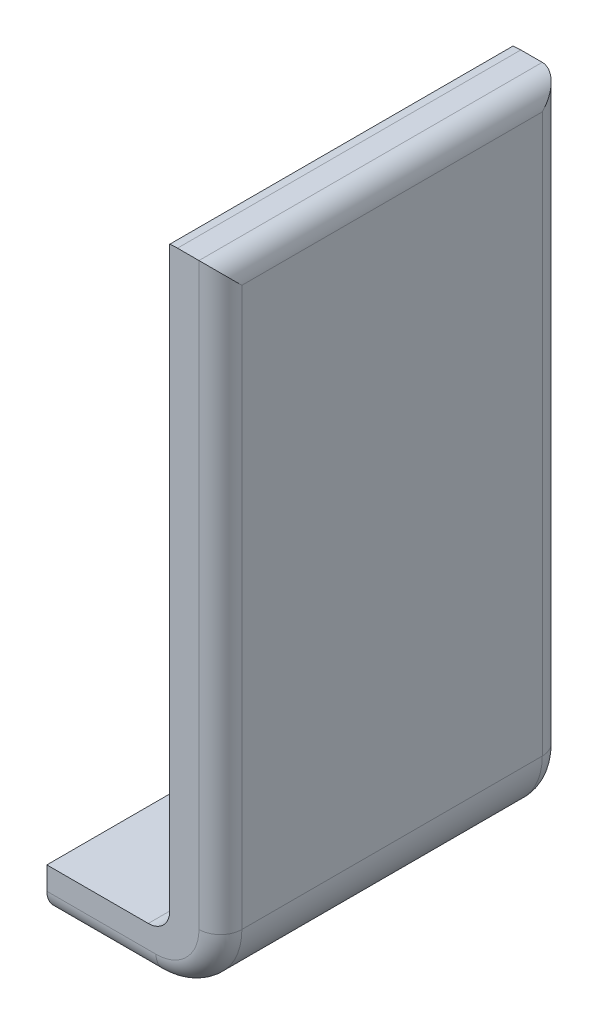
ISO-10303-21;
HEADER;
FILE_DESCRIPTION(('STEP AP214'),'2;1');
FILE_NAME('part.step','',(''),(''),'','','');
FILE_SCHEMA(('AUTOMOTIVE_DESIGN { 1 0 10303 214 1 1 1 1 }'));
ENDSEC;
DATA;
#1=APPLICATION_CONTEXT('core data for automotive mechanical design processes');
#2=APPLICATION_PROTOCOL_DEFINITION('international standard','automotive_design',2000,#1);
#3=PRODUCT_CONTEXT('',#1,'mechanical');
#4=PRODUCT('Part','Part','',(#3));
#5=PRODUCT_RELATED_PRODUCT_CATEGORY('part','',(#4));
#6=PRODUCT_DEFINITION_FORMATION('','',#4);
#7=PRODUCT_DEFINITION_CONTEXT('part definition',#1,'design');
#8=PRODUCT_DEFINITION('design','',#6,#7);
#9=PRODUCT_DEFINITION_SHAPE('','',#8);
#10=(LENGTH_UNIT() NAMED_UNIT(*) SI_UNIT(.MILLI.,.METRE.));
#11=(NAMED_UNIT(*) PLANE_ANGLE_UNIT() SI_UNIT($,.RADIAN.));
#12=(NAMED_UNIT(*) SI_UNIT($,.STERADIAN.) SOLID_ANGLE_UNIT());
#13=UNCERTAINTY_MEASURE_WITH_UNIT(LENGTH_MEASURE(1.E-05),#10,'distance_accuracy_value','');
#14=(GEOMETRIC_REPRESENTATION_CONTEXT(3) GLOBAL_UNCERTAINTY_ASSIGNED_CONTEXT((#13)) GLOBAL_UNIT_ASSIGNED_CONTEXT((#10,
#11,#12)) REPRESENTATION_CONTEXT('',''));
#15=CARTESIAN_POINT('',(0.,0.,0.));
#16=DIRECTION('',(0.,0.,1.));
#17=DIRECTION('',(1.,0.,0.));
#18=AXIS2_PLACEMENT_3D('',#15,#16,#17);
#19=CARTESIAN_POINT('',(0.,0.,16.));
#20=DIRECTION('',(0.,0.,1.));
#21=DIRECTION('',(1.,0.,0.));
#22=AXIS2_PLACEMENT_3D('',#19,#20,#21);
#23=PLANE('',#22);
#24=DIRECTION('',(0.,1.,0.));
#25=VECTOR('',#24,1.);
#26=CARTESIAN_POINT('',(13.4716852745444,0.,16.));
#27=LINE('',#26,#25);
#28=CARTESIAN_POINT('',(13.4716852745444,1.,16.));
#29=VERTEX_POINT('',#28);
#30=CARTESIAN_POINT('',(13.4716852745444,2.06313599038221,16.));
#31=VERTEX_POINT('',#30);
#32=EDGE_CURVE('E53',#29,#31,#27,.T.);
#33=ORIENTED_EDGE('',*,*,#32,.F.);
#34=DIRECTION('',(1.,0.,0.));
#35=VECTOR('',#34,1.);
#36=CARTESIAN_POINT('',(21.5609137055838,1.,16.));
#37=LINE('',#36,#35);
#38=CARTESIAN_POINT('',(18.5609137055838,1.,16.));
#39=VERTEX_POINT('',#38);
#40=EDGE_CURVE('E177',#29,#39,#37,.T.);
#41=ORIENTED_EDGE('',*,*,#40,.T.);
#42=CARTESIAN_POINT('',(18.5609137055838,3.,16.));
#43=DIRECTION('',(0.,0.,1.));
#44=DIRECTION('',(1.,0.,0.));
#45=AXIS2_PLACEMENT_3D('',#42,#43,#44);
#46=CIRCLE('',#45,2.);
#47=CARTESIAN_POINT('',(20.5609137055838,3.,16.));
#48=VERTEX_POINT('',#47);
#49=EDGE_CURVE('E199',#48,#39,#46,.F.);
#50=ORIENTED_EDGE('',*,*,#49,.F.);
#51=DIRECTION('',(0.,1.,0.));
#52=VECTOR('',#51,1.);
#53=CARTESIAN_POINT('',(20.5609137055838,30.,16.));
#54=LINE('',#53,#52);
#55=CARTESIAN_POINT('',(20.5609137055838,30.,16.));
#56=VERTEX_POINT('',#55);
#57=EDGE_CURVE('E175',#48,#56,#54,.T.);
#58=ORIENTED_EDGE('',*,*,#57,.T.);
#59=DIRECTION('',(-1.,0.,0.));
#60=VECTOR('',#59,1.);
#61=CARTESIAN_POINT('',(21.5609137055838,30.,16.));
#62=LINE('',#61,#60);
#63=CARTESIAN_POINT('',(19.5609137055838,30.,16.));
#64=VERTEX_POINT('',#63);
#65=EDGE_CURVE('E159',#56,#64,#62,.T.);
#66=ORIENTED_EDGE('',*,*,#65,.T.);
#67=CARTESIAN_POINT('',(19.5609137055838,27.,16.));
#68=DIRECTION('',(0.,0.,1.));
#69=DIRECTION('',(1.,0.,0.));
#70=AXIS2_PLACEMENT_3D('',#67,#68,#69);
#71=CIRCLE('',#70,3.);
#72=CARTESIAN_POINT('',(19.1986749982477,29.9780502210184,16.));
#73=VERTEX_POINT('',#72);
#74=EDGE_CURVE('E222',#64,#73,#71,.T.);
#75=ORIENTED_EDGE('',*,*,#74,.T.);
#76=DIRECTION('',(0.,1.,0.));
#77=VECTOR('',#76,1.);
#78=CARTESIAN_POINT('',(19.1986749982477,0.,16.));
#79=LINE('',#78,#77);
#80=CARTESIAN_POINT('',(19.1986749982477,3.06313599038221,16.));
#81=VERTEX_POINT('',#80);
#82=EDGE_CURVE('E152',#81,#73,#79,.T.);
#83=ORIENTED_EDGE('',*,*,#82,.F.);
#84=CARTESIAN_POINT('',(18.1986749982477,3.06313599038221,16.));
#85=DIRECTION('',(0.,0.,1.));
#86=DIRECTION('',(1.,0.,0.));
#87=AXIS2_PLACEMENT_3D('',#84,#85,#86);
#88=CIRCLE('',#87,1.);
#89=CARTESIAN_POINT('',(18.1986749982477,2.06313599038221,16.));
#90=VERTEX_POINT('',#89);
#91=EDGE_CURVE('E46',#81,#90,#88,.F.);
#92=ORIENTED_EDGE('',*,*,#91,.T.);
#93=DIRECTION('',(1.,0.,0.));
#94=VECTOR('',#93,1.);
#95=CARTESIAN_POINT('',(0.,2.06313599038221,16.));
#96=LINE('',#95,#94);
#97=EDGE_CURVE('E149',#31,#90,#96,.T.);
#98=ORIENTED_EDGE('',*,*,#97,.F.);
#99=EDGE_LOOP('',(#33,#41,#50,#58,#66,#75,#83,#92,#98));
#100=FACE_BOUND('',#99,.T.);
#101=ADVANCED_FACE('F38',(#100),#23,.T.);
#102=CARTESIAN_POINT('',(0.,0.,0.));
#103=DIRECTION('',(0.,0.,1.));
#104=DIRECTION('',(1.,0.,0.));
#105=AXIS2_PLACEMENT_3D('',#102,#103,#104);
#106=PLANE('',#105);
#107=DIRECTION('',(1.,0.,0.));
#108=VECTOR('',#107,1.);
#109=CARTESIAN_POINT('',(0.,1.,0.));
#110=LINE('',#109,#108);
#111=CARTESIAN_POINT('',(18.5609137055838,1.,0.));
#112=VERTEX_POINT('',#111);
#113=CARTESIAN_POINT('',(13.4716852745444,1.,0.));
#114=VERTEX_POINT('',#113);
#115=EDGE_CURVE('E141',#112,#114,#110,.F.);
#116=ORIENTED_EDGE('',*,*,#115,.T.);
#117=DIRECTION('',(0.,1.,0.));
#118=VECTOR('',#117,1.);
#119=CARTESIAN_POINT('',(13.4716852745444,0.,0.));
#120=LINE('',#119,#118);
#121=CARTESIAN_POINT('',(13.4716852745444,2.06313599038221,0.));
#122=VERTEX_POINT('',#121);
#123=EDGE_CURVE('E132',#114,#122,#120,.T.);
#124=ORIENTED_EDGE('',*,*,#123,.T.);
#125=DIRECTION('',(-1.,0.,0.));
#126=VECTOR('',#125,1.);
#127=CARTESIAN_POINT('',(19.1986749982477,2.06313599038221,0.));
#128=LINE('',#127,#126);
#129=CARTESIAN_POINT('',(18.1986749982477,2.06313599038221,0.));
#130=VERTEX_POINT('',#129);
#131=EDGE_CURVE('E139',#130,#122,#128,.T.);
#132=ORIENTED_EDGE('',*,*,#131,.F.);
#133=CARTESIAN_POINT('',(18.1986749982477,3.06313599038221,0.));
#134=DIRECTION('',(0.,0.,1.));
#135=DIRECTION('',(1.,0.,0.));
#136=AXIS2_PLACEMENT_3D('',#133,#134,#135);
#137=CIRCLE('',#136,1.);
#138=CARTESIAN_POINT('',(19.1986749982477,3.06313599038221,0.));
#139=VERTEX_POINT('',#138);
#140=EDGE_CURVE('E60',#130,#139,#137,.T.);
#141=ORIENTED_EDGE('',*,*,#140,.T.);
#142=DIRECTION('',(0.,-1.,0.));
#143=VECTOR('',#142,1.);
#144=CARTESIAN_POINT('',(19.1986749982477,30.8460054904859,0.));
#145=LINE('',#144,#143);
#146=CARTESIAN_POINT('',(19.1986749982477,29.9780502210184,0.));
#147=VERTEX_POINT('',#146);
#148=EDGE_CURVE('E150',#147,#139,#145,.T.);
#149=ORIENTED_EDGE('',*,*,#148,.F.);
#150=CARTESIAN_POINT('',(19.5609137055838,27.,0.));
#151=DIRECTION('',(0.,0.,1.));
#152=DIRECTION('',(1.,0.,0.));
#153=AXIS2_PLACEMENT_3D('',#150,#151,#152);
#154=CIRCLE('',#153,3.);
#155=CARTESIAN_POINT('',(19.5609137055838,30.,0.));
#156=VERTEX_POINT('',#155);
#157=EDGE_CURVE('E214',#147,#156,#154,.F.);
#158=ORIENTED_EDGE('',*,*,#157,.T.);
#159=DIRECTION('',(-1.,0.,0.));
#160=VECTOR('',#159,1.);
#161=CARTESIAN_POINT('',(21.5609137055838,30.,0.));
#162=LINE('',#161,#160);
#163=CARTESIAN_POINT('',(20.5609137055838,30.,0.));
#164=VERTEX_POINT('',#163);
#165=EDGE_CURVE('E163',#164,#156,#162,.T.);
#166=ORIENTED_EDGE('',*,*,#165,.F.);
#167=DIRECTION('',(0.,1.,0.));
#168=VECTOR('',#167,1.);
#169=CARTESIAN_POINT('',(20.5609137055838,0.,0.));
#170=LINE('',#169,#168);
#171=CARTESIAN_POINT('',(20.5609137055838,3.,0.));
#172=VERTEX_POINT('',#171);
#173=EDGE_CURVE('E171',#164,#172,#170,.F.);
#174=ORIENTED_EDGE('',*,*,#173,.T.);
#175=CARTESIAN_POINT('',(18.5609137055838,3.,0.));
#176=DIRECTION('',(0.,0.,1.));
#177=DIRECTION('',(1.,0.,0.));
#178=AXIS2_PLACEMENT_3D('',#175,#176,#177);
#179=CIRCLE('',#178,2.);
#180=EDGE_CURVE('E197',#112,#172,#179,.T.);
#181=ORIENTED_EDGE('',*,*,#180,.F.);
#182=EDGE_LOOP('',(#116,#124,#132,#141,#149,#158,#166,#174,#181));
#183=FACE_BOUND('',#182,.T.);
#184=ADVANCED_FACE('F138',(#183),#106,.F.);
#185=CARTESIAN_POINT('',(0.,0.,16.));
#186=DIRECTION('',(0.,1.,0.));
#187=DIRECTION('',(0.,0.,1.));
#188=AXIS2_PLACEMENT_3D('',#185,#186,#187);
#189=PLANE('',#188);
#190=DIRECTION('',(1.,0.,0.));
#191=VECTOR('',#190,1.);
#192=CARTESIAN_POINT('',(0.,0.,15.));
#193=LINE('',#192,#191);
#194=CARTESIAN_POINT('',(18.5609137055838,0.,15.));
#195=VERTEX_POINT('',#194);
#196=CARTESIAN_POINT('',(13.4716852745444,0.,15.));
#197=VERTEX_POINT('',#196);
#198=EDGE_CURVE('E162',#195,#197,#193,.F.);
#199=ORIENTED_EDGE('',*,*,#198,.T.);
#200=DIRECTION('',(0.,0.,-1.));
#201=VECTOR('',#200,1.);
#202=CARTESIAN_POINT('',(13.4716852745444,0.,16.));
#203=LINE('',#202,#201);
#204=CARTESIAN_POINT('',(13.4716852745444,0.,1.));
#205=VERTEX_POINT('',#204);
#206=EDGE_CURVE('E143',#197,#205,#203,.T.);
#207=ORIENTED_EDGE('',*,*,#206,.T.);
#208=DIRECTION('',(1.,0.,0.));
#209=VECTOR('',#208,1.);
#210=CARTESIAN_POINT('',(0.,0.,1.));
#211=LINE('',#210,#209);
#212=CARTESIAN_POINT('',(18.5609137055838,0.,1.));
#213=VERTEX_POINT('',#212);
#214=EDGE_CURVE('E169',#205,#213,#211,.T.);
#215=ORIENTED_EDGE('',*,*,#214,.T.);
#216=DIRECTION('',(0.,0.,-1.));
#217=VECTOR('',#216,1.);
#218=CARTESIAN_POINT('',(18.5609137055838,0.,16.));
#219=LINE('',#218,#217);
#220=EDGE_CURVE('E212',#213,#195,#219,.F.);
#221=ORIENTED_EDGE('',*,*,#220,.T.);
#222=EDGE_LOOP('',(#199,#207,#215,#221));
#223=FACE_BOUND('',#222,.T.);
#224=ADVANCED_FACE('F295',(#223),#189,.F.);
#225=CARTESIAN_POINT('',(21.5609137055838,0.,16.));
#226=DIRECTION('',(-1.,0.,0.));
#227=DIRECTION('',(0.,0.,1.));
#228=AXIS2_PLACEMENT_3D('',#225,#226,#227);
#229=PLANE('',#228);
#230=DIRECTION('',(0.,1.,0.));
#231=VECTOR('',#230,1.);
#232=CARTESIAN_POINT('',(21.5609137055838,0.,15.));
#233=LINE('',#232,#231);
#234=CARTESIAN_POINT('',(21.5609137055838,29.,15.));
#235=VERTEX_POINT('',#234);
#236=CARTESIAN_POINT('',(21.5609137055838,3.,15.));
#237=VERTEX_POINT('',#236);
#238=EDGE_CURVE('E181',#235,#237,#233,.F.);
#239=ORIENTED_EDGE('',*,*,#238,.T.);
#240=DIRECTION('',(0.,0.,-1.));
#241=VECTOR('',#240,1.);
#242=CARTESIAN_POINT('',(21.5609137055838,3.,16.));
#243=LINE('',#242,#241);
#244=CARTESIAN_POINT('',(21.5609137055838,3.,1.));
#245=VERTEX_POINT('',#244);
#246=EDGE_CURVE('E210',#237,#245,#243,.T.);
#247=ORIENTED_EDGE('',*,*,#246,.T.);
#248=DIRECTION('',(0.,1.,0.));
#249=VECTOR('',#248,1.);
#250=CARTESIAN_POINT('',(21.5609137055838,0.,1.));
#251=LINE('',#250,#249);
#252=CARTESIAN_POINT('',(21.5609137055838,29.,1.));
#253=VERTEX_POINT('',#252);
#254=EDGE_CURVE('E184',#245,#253,#251,.T.);
#255=ORIENTED_EDGE('',*,*,#254,.T.);
#256=DIRECTION('',(0.,0.,-1.));
#257=VECTOR('',#256,1.);
#258=CARTESIAN_POINT('',(21.5609137055838,29.,16.));
#259=LINE('',#258,#257);
#260=EDGE_CURVE('E179',#253,#235,#259,.F.);
#261=ORIENTED_EDGE('',*,*,#260,.T.);
#262=EDGE_LOOP('',(#239,#247,#255,#261));
#263=FACE_BOUND('',#262,.T.);
#264=ADVANCED_FACE('F267',(#263),#229,.F.);
#265=CARTESIAN_POINT('',(21.5609137055838,30.,16.));
#266=DIRECTION('',(0.,-1.,0.));
#267=DIRECTION('',(1.,0.,0.));
#268=AXIS2_PLACEMENT_3D('',#265,#266,#267);
#269=PLANE('',#268);
#270=ORIENTED_EDGE('',*,*,#165,.T.);
#271=DIRECTION('',(0.,0.,-1.));
#272=VECTOR('',#271,1.);
#273=CARTESIAN_POINT('',(19.5609137055838,30.,16.));
#274=LINE('',#273,#272);
#275=EDGE_CURVE('E220',#156,#64,#274,.F.);
#276=ORIENTED_EDGE('',*,*,#275,.T.);
#277=ORIENTED_EDGE('',*,*,#65,.F.);
#278=DIRECTION('',(0.,0.,-1.));
#279=VECTOR('',#278,1.);
#280=CARTESIAN_POINT('',(20.5609137055838,30.,16.));
#281=LINE('',#280,#279);
#282=EDGE_CURVE('E186',#56,#164,#281,.T.);
#283=ORIENTED_EDGE('',*,*,#282,.T.);
#284=EDGE_LOOP('',(#270,#276,#277,#283));
#285=FACE_BOUND('',#284,.T.);
#286=ADVANCED_FACE('F247',(#285),#269,.F.);
#287=CARTESIAN_POINT('',(20.5609137055838,0.,15.));
#288=DIRECTION('',(0.,-1.,0.));
#289=DIRECTION('',(0.,0.,-1.));
#290=AXIS2_PLACEMENT_3D('',#287,#288,#289);
#291=CYLINDRICAL_SURFACE('',#290,1.);
#292=ORIENTED_EDGE('',*,*,#57,.F.);
#293=CARTESIAN_POINT('',(20.5609137055838,3.,15.));
#294=DIRECTION('',(0.,1.,0.));
#295=DIRECTION('',(0.,0.,1.));
#296=AXIS2_PLACEMENT_3D('',#293,#294,#295);
#297=CIRCLE('',#296,1.);
#298=EDGE_CURVE('E205',#48,#237,#297,.T.);
#299=ORIENTED_EDGE('',*,*,#298,.T.);
#300=ORIENTED_EDGE('',*,*,#238,.F.);
#301=CARTESIAN_POINT('',(20.5609137055838,29.,15.));
#302=DIRECTION('',(0.,0.707106781186547,-0.707106781186547));
#303=DIRECTION('',(0.,-0.707106781186547,-0.707106781186547));
#304=AXIS2_PLACEMENT_3D('',#301,#302,#303);
#305=ELLIPSE('',#304,1.41421356237309,1.);
#306=EDGE_CURVE('E166',#56,#235,#305,.T.);
#307=ORIENTED_EDGE('',*,*,#306,.F.);
#308=EDGE_LOOP('',(#292,#299,#300,#307));
#309=FACE_BOUND('',#308,.T.);
#310=ADVANCED_FACE('F252',(#309),#291,.T.);
#311=CARTESIAN_POINT('',(0.,1.,15.));
#312=DIRECTION('',(-1.,0.,0.));
#313=DIRECTION('',(0.,0.,1.));
#314=AXIS2_PLACEMENT_3D('',#311,#312,#313);
#315=CYLINDRICAL_SURFACE('',#314,1.);
#316=CARTESIAN_POINT('',(13.4716852745444,1.,15.));
#317=DIRECTION('',(1.,0.,0.));
#318=DIRECTION('',(0.,0.,-1.));
#319=AXIS2_PLACEMENT_3D('',#316,#317,#318);
#320=CIRCLE('',#319,1.);
#321=EDGE_CURVE('E142',#197,#29,#320,.F.);
#322=ORIENTED_EDGE('',*,*,#321,.F.);
#323=ORIENTED_EDGE('',*,*,#198,.F.);
#324=CARTESIAN_POINT('',(18.5609137055838,1.,15.));
#325=DIRECTION('',(-1.,0.,0.));
#326=DIRECTION('',(0.,0.,1.));
#327=AXIS2_PLACEMENT_3D('',#324,#325,#326);
#328=CIRCLE('',#327,1.);
#329=EDGE_CURVE('E202',#195,#39,#328,.T.);
#330=ORIENTED_EDGE('',*,*,#329,.T.);
#331=ORIENTED_EDGE('',*,*,#40,.F.);
#332=EDGE_LOOP('',(#322,#323,#330,#331));
#333=FACE_BOUND('',#332,.T.);
#334=ADVANCED_FACE('F313',(#333),#315,.T.);
#335=CARTESIAN_POINT('',(20.5609137055838,29.,16.));
#336=DIRECTION('',(0.,0.,-1.));
#337=DIRECTION('',(-1.,0.,0.));
#338=AXIS2_PLACEMENT_3D('',#335,#336,#337);
#339=CYLINDRICAL_SURFACE('',#338,1.);
#340=ORIENTED_EDGE('',*,*,#306,.T.);
#341=ORIENTED_EDGE('',*,*,#260,.F.);
#342=CARTESIAN_POINT('',(20.5609137055838,29.,1.));
#343=DIRECTION('',(0.,-0.707106781186547,-0.707106781186547));
#344=DIRECTION('',(0.,0.707106781186547,-0.707106781186547));
#345=AXIS2_PLACEMENT_3D('',#342,#343,#344);
#346=ELLIPSE('',#345,1.41421356237309,1.);
#347=EDGE_CURVE('E189',#164,#253,#346,.T.);
#348=ORIENTED_EDGE('',*,*,#347,.F.);
#349=ORIENTED_EDGE('',*,*,#282,.F.);
#350=EDGE_LOOP('',(#340,#341,#348,#349));
#351=FACE_BOUND('',#350,.T.);
#352=ADVANCED_FACE('F274',(#351),#339,.T.);
#353=CARTESIAN_POINT('',(20.5609137055838,0.,1.));
#354=DIRECTION('',(0.,1.,0.));
#355=DIRECTION('',(0.,0.,1.));
#356=AXIS2_PLACEMENT_3D('',#353,#354,#355);
#357=CYLINDRICAL_SURFACE('',#356,1.);
#358=ORIENTED_EDGE('',*,*,#254,.F.);
#359=CARTESIAN_POINT('',(20.5609137055838,3.,1.));
#360=DIRECTION('',(0.,1.,0.));
#361=DIRECTION('',(0.,0.,1.));
#362=AXIS2_PLACEMENT_3D('',#359,#360,#361);
#363=CIRCLE('',#362,1.);
#364=EDGE_CURVE('E188',#245,#172,#363,.T.);
#365=ORIENTED_EDGE('',*,*,#364,.T.);
#366=ORIENTED_EDGE('',*,*,#173,.F.);
#367=ORIENTED_EDGE('',*,*,#347,.T.);
#368=EDGE_LOOP('',(#358,#365,#366,#367));
#369=FACE_BOUND('',#368,.T.);
#370=ADVANCED_FACE('F270',(#369),#357,.T.);
#371=CARTESIAN_POINT('',(0.,1.,1.));
#372=DIRECTION('',(1.,0.,0.));
#373=DIRECTION('',(0.,0.,-1.));
#374=AXIS2_PLACEMENT_3D('',#371,#372,#373);
#375=CYLINDRICAL_SURFACE('',#374,1.);
#376=CARTESIAN_POINT('',(13.4716852745444,1.,1.));
#377=DIRECTION('',(1.,0.,0.));
#378=DIRECTION('',(0.,0.,-1.));
#379=AXIS2_PLACEMENT_3D('',#376,#377,#378);
#380=CIRCLE('',#379,1.);
#381=EDGE_CURVE('E280',#114,#205,#380,.F.);
#382=ORIENTED_EDGE('',*,*,#381,.F.);
#383=ORIENTED_EDGE('',*,*,#115,.F.);
#384=CARTESIAN_POINT('',(18.5609137055838,1.,1.));
#385=DIRECTION('',(-1.,0.,0.));
#386=DIRECTION('',(0.,0.,1.));
#387=AXIS2_PLACEMENT_3D('',#384,#385,#386);
#388=CIRCLE('',#387,1.);
#389=EDGE_CURVE('E207',#112,#213,#388,.T.);
#390=ORIENTED_EDGE('',*,*,#389,.T.);
#391=ORIENTED_EDGE('',*,*,#214,.F.);
#392=EDGE_LOOP('',(#382,#383,#390,#391));
#393=FACE_BOUND('',#392,.T.);
#394=ADVANCED_FACE('F278',(#393),#375,.T.);
#395=CARTESIAN_POINT('',(18.5609137055838,3.,15.));
#396=DIRECTION('',(0.,0.,1.));
#397=DIRECTION('',(1.,0.,0.));
#398=AXIS2_PLACEMENT_3D('',#395,#396,#397);
#399=TOROIDAL_SURFACE('',#398,2.,1.);
#400=ORIENTED_EDGE('',*,*,#49,.T.);
#401=ORIENTED_EDGE('',*,*,#329,.F.);
#402=CARTESIAN_POINT('',(18.5609137055838,3.,15.));
#403=DIRECTION('',(0.,0.,1.));
#404=DIRECTION('',(1.,0.,0.));
#405=AXIS2_PLACEMENT_3D('',#402,#403,#404);
#406=CIRCLE('',#405,3.);
#407=EDGE_CURVE('E192',#237,#195,#406,.F.);
#408=ORIENTED_EDGE('',*,*,#407,.F.);
#409=ORIENTED_EDGE('',*,*,#298,.F.);
#410=EDGE_LOOP('',(#400,#401,#408,#409));
#411=FACE_BOUND('',#410,.T.);
#412=ADVANCED_FACE('F257',(#411),#399,.T.);
#413=CARTESIAN_POINT('',(18.5609137055838,3.,16.));
#414=DIRECTION('',(0.,0.,-1.));
#415=DIRECTION('',(-1.,0.,0.));
#416=AXIS2_PLACEMENT_3D('',#413,#414,#415);
#417=CYLINDRICAL_SURFACE('',#416,3.);
#418=ORIENTED_EDGE('',*,*,#407,.T.);
#419=ORIENTED_EDGE('',*,*,#220,.F.);
#420=CARTESIAN_POINT('',(18.5609137055838,3.,1.));
#421=DIRECTION('',(0.,0.,1.));
#422=DIRECTION('',(1.,0.,0.));
#423=AXIS2_PLACEMENT_3D('',#420,#421,#422);
#424=CIRCLE('',#423,3.);
#425=EDGE_CURVE('E158',#245,#213,#424,.F.);
#426=ORIENTED_EDGE('',*,*,#425,.F.);
#427=ORIENTED_EDGE('',*,*,#246,.F.);
#428=EDGE_LOOP('',(#418,#419,#426,#427));
#429=FACE_BOUND('',#428,.T.);
#430=ADVANCED_FACE('F263',(#429),#417,.T.);
#431=CARTESIAN_POINT('',(18.5609137055838,3.,1.));
#432=DIRECTION('',(0.,0.,1.));
#433=DIRECTION('',(1.,0.,0.));
#434=AXIS2_PLACEMENT_3D('',#431,#432,#433);
#435=TOROIDAL_SURFACE('',#434,2.,1.);
#436=ORIENTED_EDGE('',*,*,#364,.F.);
#437=ORIENTED_EDGE('',*,*,#425,.T.);
#438=ORIENTED_EDGE('',*,*,#389,.F.);
#439=ORIENTED_EDGE('',*,*,#180,.T.);
#440=EDGE_LOOP('',(#436,#437,#438,#439));
#441=FACE_BOUND('',#440,.T.);
#442=ADVANCED_FACE('F281',(#441),#435,.T.);
#443=CARTESIAN_POINT('',(19.5609137055838,27.,16.));
#444=DIRECTION('',(0.,0.,-1.));
#445=DIRECTION('',(-1.,0.,0.));
#446=AXIS2_PLACEMENT_3D('',#443,#444,#445);
#447=CYLINDRICAL_SURFACE('',#446,3.);
#448=DIRECTION('',(0.,0.,-1.));
#449=VECTOR('',#448,1.);
#450=CARTESIAN_POINT('',(19.1986749982477,29.9780502210184,16.));
#451=LINE('',#450,#449);
#452=EDGE_CURVE('E225',#73,#147,#451,.T.);
#453=ORIENTED_EDGE('',*,*,#452,.F.);
#454=ORIENTED_EDGE('',*,*,#74,.F.);
#455=ORIENTED_EDGE('',*,*,#275,.F.);
#456=ORIENTED_EDGE('',*,*,#157,.F.);
#457=EDGE_LOOP('',(#453,#454,#455,#456));
#458=FACE_BOUND('',#457,.T.);
#459=ADVANCED_FACE('F243',(#458),#447,.T.);
#460=CARTESIAN_POINT('',(19.1986749982477,30.8460054904859,33.));
#461=DIRECTION('',(1.,0.,0.));
#462=DIRECTION('',(0.,0.,-1.));
#463=AXIS2_PLACEMENT_3D('',#460,#461,#462);
#464=PLANE('',#463);
#465=ORIENTED_EDGE('',*,*,#148,.T.);
#466=DIRECTION('',(0.,0.,-1.));
#467=VECTOR('',#466,1.);
#468=CARTESIAN_POINT('',(19.1986749982477,3.06313599038221,16.));
#469=LINE('',#468,#467);
#470=EDGE_CURVE('E228',#139,#81,#469,.F.);
#471=ORIENTED_EDGE('',*,*,#470,.T.);
#472=ORIENTED_EDGE('',*,*,#82,.T.);
#473=ORIENTED_EDGE('',*,*,#452,.T.);
#474=EDGE_LOOP('',(#465,#471,#472,#473));
#475=FACE_BOUND('',#474,.T.);
#476=ADVANCED_FACE('F237',(#475),#464,.F.);
#477=CARTESIAN_POINT('',(19.1986749982477,2.06313599038221,33.));
#478=DIRECTION('',(0.,-1.,0.));
#479=DIRECTION('',(0.,0.,-1.));
#480=AXIS2_PLACEMENT_3D('',#477,#478,#479);
#481=PLANE('',#480);
#482=ORIENTED_EDGE('',*,*,#131,.T.);
#483=DIRECTION('',(0.,0.,1.));
#484=VECTOR('',#483,1.);
#485=CARTESIAN_POINT('',(13.4716852745444,2.06313599038221,33.));
#486=LINE('',#485,#484);
#487=EDGE_CURVE('E11',#122,#31,#486,.T.);
#488=ORIENTED_EDGE('',*,*,#487,.T.);
#489=ORIENTED_EDGE('',*,*,#97,.T.);
#490=DIRECTION('',(0.,0.,-1.));
#491=VECTOR('',#490,1.);
#492=CARTESIAN_POINT('',(18.1986749982477,2.06313599038221,0.));
#493=LINE('',#492,#491);
#494=EDGE_CURVE('E148',#90,#130,#493,.T.);
#495=ORIENTED_EDGE('',*,*,#494,.T.);
#496=EDGE_LOOP('',(#482,#488,#489,#495));
#497=FACE_BOUND('',#496,.T.);
#498=ADVANCED_FACE('F146',(#497),#481,.F.);
#499=CARTESIAN_POINT('',(18.1986749982477,3.06313599038221,33.));
#500=DIRECTION('',(0.,0.,1.));
#501=DIRECTION('',(1.,0.,0.));
#502=AXIS2_PLACEMENT_3D('',#499,#500,#501);
#503=CYLINDRICAL_SURFACE('',#502,1.);
#504=ORIENTED_EDGE('',*,*,#91,.F.);
#505=ORIENTED_EDGE('',*,*,#470,.F.);
#506=ORIENTED_EDGE('',*,*,#140,.F.);
#507=ORIENTED_EDGE('',*,*,#494,.F.);
#508=EDGE_LOOP('',(#504,#505,#506,#507));
#509=FACE_BOUND('',#508,.T.);
#510=ADVANCED_FACE('F40',(#509),#503,.F.);
#511=CARTESIAN_POINT('',(13.4716852745444,-30.9368640096178,-0.830830115113159));
#512=DIRECTION('',(1.,0.,0.));
#513=DIRECTION('',(0.,0.,-1.));
#514=AXIS2_PLACEMENT_3D('',#511,#512,#513);
#515=PLANE('',#514);
#516=ORIENTED_EDGE('',*,*,#32,.T.);
#517=ORIENTED_EDGE('',*,*,#487,.F.);
#518=ORIENTED_EDGE('',*,*,#123,.F.);
#519=ORIENTED_EDGE('',*,*,#381,.T.);
#520=ORIENTED_EDGE('',*,*,#206,.F.);
#521=ORIENTED_EDGE('',*,*,#321,.T.);
#522=EDGE_LOOP('',(#516,#517,#518,#519,#520,#521));
#523=FACE_BOUND('',#522,.T.);
#524=ADVANCED_FACE('F131',(#523),#515,.F.);
#525=CLOSED_SHELL('',(#101,#184,#224,#264,#286,#310,#334,#352,#370,#394,#412,#430,#442,#459,
#476,#498,#510,#524));
#526=MANIFOLD_SOLID_BREP('B2',#525);
#527=ADVANCED_BREP_SHAPE_REPRESENTATION('',(#18,#526),#14);
#528=SHAPE_DEFINITION_REPRESENTATION(#9,#527);
ENDSEC;
END-ISO-10303-21;
